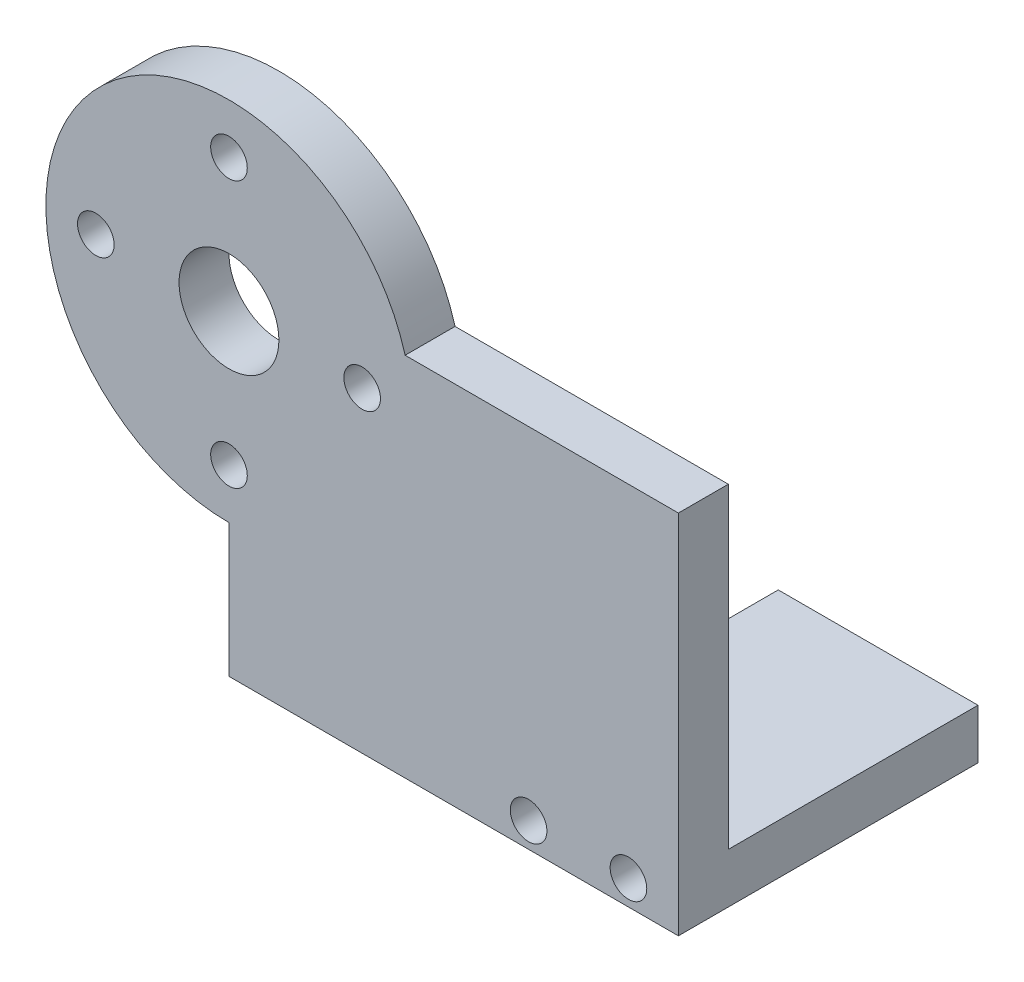
ISO-10303-21;
HEADER;
FILE_DESCRIPTION(('STEP AP214'),'2;1');
FILE_NAME('part.step','',(''),(''),'','','');
FILE_SCHEMA(('AUTOMOTIVE_DESIGN { 1 0 10303 214 1 1 1 1 }'));
ENDSEC;
DATA;
#1=APPLICATION_CONTEXT('core data for automotive mechanical design processes');
#2=APPLICATION_PROTOCOL_DEFINITION('international standard','automotive_design',2000,#1);
#3=PRODUCT_CONTEXT('',#1,'mechanical');
#4=PRODUCT('Part','Part','',(#3));
#5=PRODUCT_RELATED_PRODUCT_CATEGORY('part','',(#4));
#6=PRODUCT_DEFINITION_FORMATION('','',#4);
#7=PRODUCT_DEFINITION_CONTEXT('part definition',#1,'design');
#8=PRODUCT_DEFINITION('design','',#6,#7);
#9=PRODUCT_DEFINITION_SHAPE('','',#8);
#10=(LENGTH_UNIT() NAMED_UNIT(*) SI_UNIT(.MILLI.,.METRE.));
#11=(NAMED_UNIT(*) PLANE_ANGLE_UNIT() SI_UNIT($,.RADIAN.));
#12=(NAMED_UNIT(*) SI_UNIT($,.STERADIAN.) SOLID_ANGLE_UNIT());
#13=UNCERTAINTY_MEASURE_WITH_UNIT(LENGTH_MEASURE(1.E-05),#10,'distance_accuracy_value','');
#14=(GEOMETRIC_REPRESENTATION_CONTEXT(3) GLOBAL_UNCERTAINTY_ASSIGNED_CONTEXT((#13)) GLOBAL_UNIT_ASSIGNED_CONTEXT((#10,
#11,#12)) REPRESENTATION_CONTEXT('',''));
#15=CARTESIAN_POINT('',(0.,0.,0.));
#16=DIRECTION('',(0.,0.,1.));
#17=DIRECTION('',(1.,0.,0.));
#18=AXIS2_PLACEMENT_3D('',#15,#16,#17);
#19=CARTESIAN_POINT('',(0.,0.,15.));
#20=DIRECTION('',(0.,0.,1.));
#21=DIRECTION('',(1.,0.,0.));
#22=AXIS2_PLACEMENT_3D('',#19,#20,#21);
#23=PLANE('',#22);
#24=CARTESIAN_POINT('',(0.,-8.,15.));
#25=DIRECTION('',(0.,0.,1.));
#26=DIRECTION('',(1.,0.,0.));
#27=AXIS2_PLACEMENT_3D('',#24,#25,#26);
#28=CIRCLE('',#27,1.1);
#29=CARTESIAN_POINT('',(1.1,-8.,15.));
#30=VERTEX_POINT('',#29);
#31=EDGE_CURVE('E247',#30,#30,#28,.F.);
#32=ORIENTED_EDGE('',*,*,#31,.F.);
#33=EDGE_LOOP('',(#32));
#34=FACE_BOUND('',#33,.T.);
#35=CARTESIAN_POINT('',(0.,8.,15.));
#36=DIRECTION('',(0.,0.,1.));
#37=DIRECTION('',(1.,0.,0.));
#38=AXIS2_PLACEMENT_3D('',#35,#36,#37);
#39=CIRCLE('',#38,1.1);
#40=CARTESIAN_POINT('',(1.1,8.,15.));
#41=VERTEX_POINT('',#40);
#42=EDGE_CURVE('E249',#41,#41,#39,.F.);
#43=ORIENTED_EDGE('',*,*,#42,.F.);
#44=EDGE_LOOP('',(#43));
#45=FACE_BOUND('',#44,.T.);
#46=CARTESIAN_POINT('',(-8.,0.,15.));
#47=DIRECTION('',(0.,0.,1.));
#48=DIRECTION('',(1.,0.,0.));
#49=AXIS2_PLACEMENT_3D('',#46,#47,#48);
#50=CIRCLE('',#49,1.1);
#51=CARTESIAN_POINT('',(-6.9,0.,15.));
#52=VERTEX_POINT('',#51);
#53=EDGE_CURVE('E241',#52,#52,#50,.F.);
#54=ORIENTED_EDGE('',*,*,#53,.F.);
#55=EDGE_LOOP('',(#54));
#56=FACE_BOUND('',#55,.T.);
#57=CARTESIAN_POINT('',(8.,0.,15.));
#58=DIRECTION('',(0.,0.,1.));
#59=DIRECTION('',(1.,0.,0.));
#60=AXIS2_PLACEMENT_3D('',#57,#58,#59);
#61=CIRCLE('',#60,1.1);
#62=CARTESIAN_POINT('',(9.1,0.,15.));
#63=VERTEX_POINT('',#62);
#64=EDGE_CURVE('E226',#63,#63,#61,.F.);
#65=ORIENTED_EDGE('',*,*,#64,.F.);
#66=EDGE_LOOP('',(#65));
#67=FACE_BOUND('',#66,.T.);
#68=CARTESIAN_POINT('',(0.,0.,15.));
#69=DIRECTION('',(0.,0.,1.));
#70=DIRECTION('',(1.,0.,0.));
#71=AXIS2_PLACEMENT_3D('',#68,#69,#70);
#72=CIRCLE('',#71,3.);
#73=CARTESIAN_POINT('',(3.,0.,15.));
#74=VERTEX_POINT('',#73);
#75=EDGE_CURVE('E136',#74,#74,#72,.F.);
#76=ORIENTED_EDGE('',*,*,#75,.F.);
#77=EDGE_LOOP('',(#76));
#78=FACE_BOUND('',#77,.T.);
#79=DIRECTION('',(0.,1.,0.));
#80=VECTOR('',#79,1.);
#81=CARTESIAN_POINT('',(15.,0.,15.));
#82=LINE('',#81,#80);
#83=CARTESIAN_POINT('',(15.,-19.,15.));
#84=VERTEX_POINT('',#83);
#85=CARTESIAN_POINT('',(15.,-16.,15.));
#86=VERTEX_POINT('',#85);
#87=EDGE_CURVE('E11',#84,#86,#82,.T.);
#88=ORIENTED_EDGE('',*,*,#87,.F.);
#89=DIRECTION('',(1.,0.,0.));
#90=VECTOR('',#89,1.);
#91=CARTESIAN_POINT('',(0.,-19.,15.));
#92=LINE('',#91,#90);
#93=CARTESIAN_POINT('',(0.,-19.,15.));
#94=VERTEX_POINT('',#93);
#95=EDGE_CURVE('E119',#94,#84,#92,.T.);
#96=ORIENTED_EDGE('',*,*,#95,.F.);
#97=DIRECTION('',(0.,-1.,0.));
#98=VECTOR('',#97,1.);
#99=CARTESIAN_POINT('',(0.,-19.,15.));
#100=LINE('',#99,#98);
#101=CARTESIAN_POINT('',(0.,-11.,15.));
#102=VERTEX_POINT('',#101);
#103=EDGE_CURVE('E117',#102,#94,#100,.T.);
#104=ORIENTED_EDGE('',*,*,#103,.F.);
#105=CARTESIAN_POINT('',(0.,0.,15.));
#106=DIRECTION('',(0.,0.,1.));
#107=DIRECTION('',(1.,0.,0.));
#108=AXIS2_PLACEMENT_3D('',#105,#106,#107);
#109=CIRCLE('',#108,11.);
#110=CARTESIAN_POINT('',(10.5830052442584,3.,15.));
#111=VERTEX_POINT('',#110);
#112=EDGE_CURVE('E191',#111,#102,#109,.T.);
#113=ORIENTED_EDGE('',*,*,#112,.F.);
#114=DIRECTION('',(-1.,0.,0.));
#115=VECTOR('',#114,1.);
#116=CARTESIAN_POINT('',(0.,3.,15.));
#117=LINE('',#116,#115);
#118=CARTESIAN_POINT('',(27.,3.,15.));
#119=VERTEX_POINT('',#118);
#120=EDGE_CURVE('E158',#119,#111,#117,.T.);
#121=ORIENTED_EDGE('',*,*,#120,.F.);
#122=DIRECTION('',(0.,1.,0.));
#123=VECTOR('',#122,1.);
#124=CARTESIAN_POINT('',(27.,-19.,15.));
#125=LINE('',#124,#123);
#126=CARTESIAN_POINT('',(27.,-16.,15.));
#127=VERTEX_POINT('',#126);
#128=EDGE_CURVE('E175',#127,#119,#125,.T.);
#129=ORIENTED_EDGE('',*,*,#128,.F.);
#130=DIRECTION('',(1.,0.,0.));
#131=VECTOR('',#130,1.);
#132=CARTESIAN_POINT('',(0.,-16.,15.));
#133=LINE('',#132,#131);
#134=EDGE_CURVE('E54',#86,#127,#133,.T.);
#135=ORIENTED_EDGE('',*,*,#134,.F.);
#136=EDGE_LOOP('',(#88,#96,#104,#113,#121,#129,#135));
#137=FACE_BOUND('',#136,.T.);
#138=ADVANCED_FACE('F44',(#34,#45,#56,#67,#78,#137),#23,.F.);
#139=CARTESIAN_POINT('',(0.,0.,18.));
#140=DIRECTION('',(0.,0.,-1.));
#141=DIRECTION('',(-1.,0.,0.));
#142=AXIS2_PLACEMENT_3D('',#139,#140,#141);
#143=CYLINDRICAL_SURFACE('',#142,11.);
#144=DIRECTION('',(0.,0.,-1.));
#145=VECTOR('',#144,1.);
#146=CARTESIAN_POINT('',(0.,-11.,18.));
#147=LINE('',#146,#145);
#148=CARTESIAN_POINT('',(0.,-11.,18.));
#149=VERTEX_POINT('',#148);
#150=EDGE_CURVE('E197',#149,#102,#147,.T.);
#151=ORIENTED_EDGE('',*,*,#150,.F.);
#152=CARTESIAN_POINT('',(0.,0.,18.));
#153=DIRECTION('',(0.,0.,1.));
#154=DIRECTION('',(1.,0.,0.));
#155=AXIS2_PLACEMENT_3D('',#152,#153,#154);
#156=CIRCLE('',#155,11.);
#157=CARTESIAN_POINT('',(10.5830052442584,3.,18.));
#158=VERTEX_POINT('',#157);
#159=EDGE_CURVE('E195',#158,#149,#156,.T.);
#160=ORIENTED_EDGE('',*,*,#159,.F.);
#161=DIRECTION('',(0.,0.,-1.));
#162=VECTOR('',#161,1.);
#163=CARTESIAN_POINT('',(10.5830052442584,3.,18.));
#164=LINE('',#163,#162);
#165=EDGE_CURVE('E190',#111,#158,#164,.F.);
#166=ORIENTED_EDGE('',*,*,#165,.F.);
#167=ORIENTED_EDGE('',*,*,#112,.T.);
#168=EDGE_LOOP('',(#151,#160,#166,#167));
#169=FACE_BOUND('',#168,.T.);
#170=ADVANCED_FACE('F50',(#169),#143,.T.);
#171=CARTESIAN_POINT('',(0.,0.,18.));
#172=DIRECTION('',(0.,0.,1.));
#173=DIRECTION('',(1.,0.,0.));
#174=AXIS2_PLACEMENT_3D('',#171,#172,#173);
#175=PLANE('',#174);
#176=CARTESIAN_POINT('',(18.,-17.5,18.));
#177=DIRECTION('',(0.,0.,1.));
#178=DIRECTION('',(1.,0.,0.));
#179=AXIS2_PLACEMENT_3D('',#176,#177,#178);
#180=CIRCLE('',#179,1.1);
#181=CARTESIAN_POINT('',(19.1,-17.5,18.));
#182=VERTEX_POINT('',#181);
#183=EDGE_CURVE('E210',#182,#182,#180,.T.);
#184=ORIENTED_EDGE('',*,*,#183,.F.);
#185=EDGE_LOOP('',(#184));
#186=FACE_BOUND('',#185,.T.);
#187=CARTESIAN_POINT('',(24.,-17.5,18.));
#188=DIRECTION('',(0.,0.,1.));
#189=DIRECTION('',(1.,0.,0.));
#190=AXIS2_PLACEMENT_3D('',#187,#188,#189);
#191=CIRCLE('',#190,1.1);
#192=CARTESIAN_POINT('',(25.1,-17.5,18.));
#193=VERTEX_POINT('',#192);
#194=EDGE_CURVE('E214',#193,#193,#191,.T.);
#195=ORIENTED_EDGE('',*,*,#194,.F.);
#196=EDGE_LOOP('',(#195));
#197=FACE_BOUND('',#196,.T.);
#198=CARTESIAN_POINT('',(0.,-8.,18.));
#199=DIRECTION('',(0.,0.,1.));
#200=DIRECTION('',(1.,0.,0.));
#201=AXIS2_PLACEMENT_3D('',#198,#199,#200);
#202=CIRCLE('',#201,1.1);
#203=CARTESIAN_POINT('',(1.1,-8.,18.));
#204=VERTEX_POINT('',#203);
#205=EDGE_CURVE('E224',#204,#204,#202,.T.);
#206=ORIENTED_EDGE('',*,*,#205,.F.);
#207=EDGE_LOOP('',(#206));
#208=FACE_BOUND('',#207,.T.);
#209=CARTESIAN_POINT('',(0.,8.,18.));
#210=DIRECTION('',(0.,0.,1.));
#211=DIRECTION('',(1.,0.,0.));
#212=AXIS2_PLACEMENT_3D('',#209,#210,#211);
#213=CIRCLE('',#212,1.1);
#214=CARTESIAN_POINT('',(1.1,8.,18.));
#215=VERTEX_POINT('',#214);
#216=EDGE_CURVE('E230',#215,#215,#213,.T.);
#217=ORIENTED_EDGE('',*,*,#216,.F.);
#218=EDGE_LOOP('',(#217));
#219=FACE_BOUND('',#218,.T.);
#220=CARTESIAN_POINT('',(-8.,0.,18.));
#221=DIRECTION('',(0.,0.,1.));
#222=DIRECTION('',(1.,0.,0.));
#223=AXIS2_PLACEMENT_3D('',#220,#221,#222);
#224=CIRCLE('',#223,1.1);
#225=CARTESIAN_POINT('',(-6.9,0.,18.));
#226=VERTEX_POINT('',#225);
#227=EDGE_CURVE('E231',#226,#226,#224,.T.);
#228=ORIENTED_EDGE('',*,*,#227,.F.);
#229=EDGE_LOOP('',(#228));
#230=FACE_BOUND('',#229,.T.);
#231=CARTESIAN_POINT('',(8.,0.,18.));
#232=DIRECTION('',(0.,0.,1.));
#233=DIRECTION('',(1.,0.,0.));
#234=AXIS2_PLACEMENT_3D('',#231,#232,#233);
#235=CIRCLE('',#234,1.1);
#236=CARTESIAN_POINT('',(9.1,0.,18.));
#237=VERTEX_POINT('',#236);
#238=EDGE_CURVE('E213',#237,#237,#235,.T.);
#239=ORIENTED_EDGE('',*,*,#238,.F.);
#240=EDGE_LOOP('',(#239));
#241=FACE_BOUND('',#240,.T.);
#242=CARTESIAN_POINT('',(0.,0.,18.));
#243=DIRECTION('',(0.,0.,1.));
#244=DIRECTION('',(1.,0.,0.));
#245=AXIS2_PLACEMENT_3D('',#242,#243,#244);
#246=CIRCLE('',#245,3.);
#247=CARTESIAN_POINT('',(3.,0.,18.));
#248=VERTEX_POINT('',#247);
#249=EDGE_CURVE('E143',#248,#248,#246,.T.);
#250=ORIENTED_EDGE('',*,*,#249,.F.);
#251=EDGE_LOOP('',(#250));
#252=FACE_BOUND('',#251,.T.);
#253=DIRECTION('',(1.,0.,0.));
#254=VECTOR('',#253,1.);
#255=CARTESIAN_POINT('',(0.,-19.,18.));
#256=LINE('',#255,#254);
#257=CARTESIAN_POINT('',(0.,-19.,18.));
#258=VERTEX_POINT('',#257);
#259=CARTESIAN_POINT('',(27.,-19.,18.));
#260=VERTEX_POINT('',#259);
#261=EDGE_CURVE('E160',#258,#260,#256,.T.);
#262=ORIENTED_EDGE('',*,*,#261,.T.);
#263=DIRECTION('',(0.,1.,0.));
#264=VECTOR('',#263,1.);
#265=CARTESIAN_POINT('',(27.,-19.,18.));
#266=LINE('',#265,#264);
#267=CARTESIAN_POINT('',(27.,3.,18.));
#268=VERTEX_POINT('',#267);
#269=EDGE_CURVE('E161',#260,#268,#266,.T.);
#270=ORIENTED_EDGE('',*,*,#269,.T.);
#271=DIRECTION('',(-1.,0.,0.));
#272=VECTOR('',#271,1.);
#273=CARTESIAN_POINT('',(0.,3.,18.));
#274=LINE('',#273,#272);
#275=EDGE_CURVE('E163',#268,#158,#274,.T.);
#276=ORIENTED_EDGE('',*,*,#275,.T.);
#277=ORIENTED_EDGE('',*,*,#159,.T.);
#278=DIRECTION('',(0.,-1.,0.));
#279=VECTOR('',#278,1.);
#280=CARTESIAN_POINT('',(0.,-19.,18.));
#281=LINE('',#280,#279);
#282=EDGE_CURVE('E152',#149,#258,#281,.T.);
#283=ORIENTED_EDGE('',*,*,#282,.T.);
#284=EDGE_LOOP('',(#262,#270,#276,#277,#283));
#285=FACE_BOUND('',#284,.T.);
#286=ADVANCED_FACE('F257',(#186,#197,#208,#219,#230,#241,#252,#285),#175,.T.);
#287=CARTESIAN_POINT('',(0.,-19.,18.));
#288=DIRECTION('',(1.,0.,0.));
#289=DIRECTION('',(0.,0.,-1.));
#290=AXIS2_PLACEMENT_3D('',#287,#288,#289);
#291=PLANE('',#290);
#292=ORIENTED_EDGE('',*,*,#282,.F.);
#293=ORIENTED_EDGE('',*,*,#150,.T.);
#294=ORIENTED_EDGE('',*,*,#103,.T.);
#295=DIRECTION('',(0.,0.,-1.));
#296=VECTOR('',#295,1.);
#297=CARTESIAN_POINT('',(0.,-19.,18.));
#298=LINE('',#297,#296);
#299=EDGE_CURVE('E183',#258,#94,#298,.T.);
#300=ORIENTED_EDGE('',*,*,#299,.F.);
#301=EDGE_LOOP('',(#292,#293,#294,#300));
#302=FACE_BOUND('',#301,.T.);
#303=ADVANCED_FACE('F263',(#302),#291,.F.);
#304=CARTESIAN_POINT('',(0.,3.,18.));
#305=DIRECTION('',(0.,-1.,0.));
#306=DIRECTION('',(0.,0.,-1.));
#307=AXIS2_PLACEMENT_3D('',#304,#305,#306);
#308=PLANE('',#307);
#309=ORIENTED_EDGE('',*,*,#120,.T.);
#310=ORIENTED_EDGE('',*,*,#165,.T.);
#311=ORIENTED_EDGE('',*,*,#275,.F.);
#312=DIRECTION('',(0.,0.,-1.));
#313=VECTOR('',#312,1.);
#314=CARTESIAN_POINT('',(27.,3.,18.));
#315=LINE('',#314,#313);
#316=EDGE_CURVE('E169',#268,#119,#315,.T.);
#317=ORIENTED_EDGE('',*,*,#316,.T.);
#318=EDGE_LOOP('',(#309,#310,#311,#317));
#319=FACE_BOUND('',#318,.T.);
#320=ADVANCED_FACE('F280',(#319),#308,.F.);
#321=CARTESIAN_POINT('',(0.,-19.,18.));
#322=DIRECTION('',(0.,1.,0.));
#323=DIRECTION('',(0.,0.,1.));
#324=AXIS2_PLACEMENT_3D('',#321,#322,#323);
#325=PLANE('',#324);
#326=DIRECTION('',(0.,0.,-1.));
#327=VECTOR('',#326,1.);
#328=CARTESIAN_POINT('',(27.,-19.,18.));
#329=LINE('',#328,#327);
#330=CARTESIAN_POINT('',(27.,-19.,0.));
#331=VERTEX_POINT('',#330);
#332=EDGE_CURVE('E185',#260,#331,#329,.T.);
#333=ORIENTED_EDGE('',*,*,#332,.F.);
#334=ORIENTED_EDGE('',*,*,#261,.F.);
#335=ORIENTED_EDGE('',*,*,#299,.T.);
#336=ORIENTED_EDGE('',*,*,#95,.T.);
#337=DIRECTION('',(0.,0.,-1.));
#338=VECTOR('',#337,1.);
#339=CARTESIAN_POINT('',(15.,-19.,18.));
#340=LINE('',#339,#338);
#341=CARTESIAN_POINT('',(15.,-19.,0.));
#342=VERTEX_POINT('',#341);
#343=EDGE_CURVE('E108',#84,#342,#340,.T.);
#344=ORIENTED_EDGE('',*,*,#343,.T.);
#345=DIRECTION('',(1.,0.,0.));
#346=VECTOR('',#345,1.);
#347=CARTESIAN_POINT('',(15.,-19.,0.));
#348=LINE('',#347,#346);
#349=EDGE_CURVE('E114',#342,#331,#348,.T.);
#350=ORIENTED_EDGE('',*,*,#349,.T.);
#351=EDGE_LOOP('',(#333,#334,#335,#336,#344,#350));
#352=FACE_BOUND('',#351,.T.);
#353=ADVANCED_FACE('F115',(#352),#325,.F.);
#354=CARTESIAN_POINT('',(27.,-19.,18.));
#355=DIRECTION('',(-1.,0.,0.));
#356=DIRECTION('',(0.,0.,1.));
#357=AXIS2_PLACEMENT_3D('',#354,#355,#356);
#358=PLANE('',#357);
#359=ORIENTED_EDGE('',*,*,#316,.F.);
#360=ORIENTED_EDGE('',*,*,#269,.F.);
#361=ORIENTED_EDGE('',*,*,#332,.T.);
#362=DIRECTION('',(0.,1.,0.));
#363=VECTOR('',#362,1.);
#364=CARTESIAN_POINT('',(27.,-19.,0.));
#365=LINE('',#364,#363);
#366=CARTESIAN_POINT('',(27.,-16.,0.));
#367=VERTEX_POINT('',#366);
#368=EDGE_CURVE('E129',#331,#367,#365,.T.);
#369=ORIENTED_EDGE('',*,*,#368,.T.);
#370=DIRECTION('',(0.,0.,-1.));
#371=VECTOR('',#370,1.);
#372=CARTESIAN_POINT('',(27.,-16.,18.));
#373=LINE('',#372,#371);
#374=EDGE_CURVE('E124',#127,#367,#373,.T.);
#375=ORIENTED_EDGE('',*,*,#374,.F.);
#376=ORIENTED_EDGE('',*,*,#128,.T.);
#377=EDGE_LOOP('',(#359,#360,#361,#369,#375,#376));
#378=FACE_BOUND('',#377,.T.);
#379=ADVANCED_FACE('F275',(#378),#358,.F.);
#380=CARTESIAN_POINT('',(15.,-19.,18.));
#381=DIRECTION('',(1.,0.,0.));
#382=DIRECTION('',(0.,0.,-1.));
#383=AXIS2_PLACEMENT_3D('',#380,#381,#382);
#384=PLANE('',#383);
#385=ORIENTED_EDGE('',*,*,#343,.F.);
#386=ORIENTED_EDGE('',*,*,#87,.T.);
#387=DIRECTION('',(0.,0.,-1.));
#388=VECTOR('',#387,1.);
#389=CARTESIAN_POINT('',(15.,-16.,18.));
#390=LINE('',#389,#388);
#391=CARTESIAN_POINT('',(15.,-16.,0.));
#392=VERTEX_POINT('',#391);
#393=EDGE_CURVE('E133',#86,#392,#390,.T.);
#394=ORIENTED_EDGE('',*,*,#393,.T.);
#395=DIRECTION('',(0.,-1.,0.));
#396=VECTOR('',#395,1.);
#397=CARTESIAN_POINT('',(15.,-19.,0.));
#398=LINE('',#397,#396);
#399=EDGE_CURVE('E130',#392,#342,#398,.T.);
#400=ORIENTED_EDGE('',*,*,#399,.T.);
#401=EDGE_LOOP('',(#385,#386,#394,#400));
#402=FACE_BOUND('',#401,.T.);
#403=ADVANCED_FACE('F131',(#402),#384,.F.);
#404=CARTESIAN_POINT('',(15.,-16.,18.));
#405=DIRECTION('',(0.,-1.,0.));
#406=DIRECTION('',(0.,0.,-1.));
#407=AXIS2_PLACEMENT_3D('',#404,#405,#406);
#408=PLANE('',#407);
#409=ORIENTED_EDGE('',*,*,#393,.F.);
#410=ORIENTED_EDGE('',*,*,#134,.T.);
#411=ORIENTED_EDGE('',*,*,#374,.T.);
#412=DIRECTION('',(-1.,0.,0.));
#413=VECTOR('',#412,1.);
#414=CARTESIAN_POINT('',(15.,-16.,0.));
#415=LINE('',#414,#413);
#416=EDGE_CURVE('E150',#367,#392,#415,.T.);
#417=ORIENTED_EDGE('',*,*,#416,.T.);
#418=EDGE_LOOP('',(#409,#410,#411,#417));
#419=FACE_BOUND('',#418,.T.);
#420=ADVANCED_FACE('F301',(#419),#408,.F.);
#421=CARTESIAN_POINT('',(0.,0.,0.));
#422=DIRECTION('',(0.,0.,-1.));
#423=DIRECTION('',(-1.,0.,0.));
#424=AXIS2_PLACEMENT_3D('',#421,#422,#423);
#425=PLANE('',#424);
#426=CARTESIAN_POINT('',(18.,-17.5,0.));
#427=DIRECTION('',(0.,0.,-1.));
#428=DIRECTION('',(-1.,0.,0.));
#429=AXIS2_PLACEMENT_3D('',#426,#427,#428);
#430=CIRCLE('',#429,1.1);
#431=CARTESIAN_POINT('',(16.9,-17.5,0.));
#432=VERTEX_POINT('',#431);
#433=EDGE_CURVE('E47',#432,#432,#430,.F.);
#434=ORIENTED_EDGE('',*,*,#433,.T.);
#435=EDGE_LOOP('',(#434));
#436=FACE_BOUND('',#435,.T.);
#437=CARTESIAN_POINT('',(24.,-17.5,0.));
#438=DIRECTION('',(0.,0.,-1.));
#439=DIRECTION('',(-1.,0.,0.));
#440=AXIS2_PLACEMENT_3D('',#437,#438,#439);
#441=CIRCLE('',#440,1.1);
#442=CARTESIAN_POINT('',(22.9,-17.5,0.));
#443=VERTEX_POINT('',#442);
#444=EDGE_CURVE('E204',#443,#443,#441,.F.);
#445=ORIENTED_EDGE('',*,*,#444,.T.);
#446=EDGE_LOOP('',(#445));
#447=FACE_BOUND('',#446,.T.);
#448=ORIENTED_EDGE('',*,*,#399,.F.);
#449=ORIENTED_EDGE('',*,*,#416,.F.);
#450=ORIENTED_EDGE('',*,*,#368,.F.);
#451=ORIENTED_EDGE('',*,*,#349,.F.);
#452=EDGE_LOOP('',(#448,#449,#450,#451));
#453=FACE_BOUND('',#452,.T.);
#454=ADVANCED_FACE('F122',(#436,#447,#453),#425,.T.);
#455=CARTESIAN_POINT('',(0.,0.,18.));
#456=DIRECTION('',(0.,0.,-1.));
#457=DIRECTION('',(-1.,0.,0.));
#458=AXIS2_PLACEMENT_3D('',#455,#456,#457);
#459=CYLINDRICAL_SURFACE('',#458,3.);
#460=ORIENTED_EDGE('',*,*,#249,.T.);
#461=EDGE_LOOP('',(#460));
#462=FACE_BOUND('',#461,.T.);
#463=ORIENTED_EDGE('',*,*,#75,.T.);
#464=EDGE_LOOP('',(#463));
#465=FACE_BOUND('',#464,.T.);
#466=ADVANCED_FACE('F260',(#462,#465),#459,.F.);
#467=CARTESIAN_POINT('',(8.,0.,18.));
#468=DIRECTION('',(0.,0.,-1.));
#469=DIRECTION('',(-1.,0.,0.));
#470=AXIS2_PLACEMENT_3D('',#467,#468,#469);
#471=CYLINDRICAL_SURFACE('',#470,1.1);
#472=ORIENTED_EDGE('',*,*,#238,.T.);
#473=EDGE_LOOP('',(#472));
#474=FACE_BOUND('',#473,.T.);
#475=ORIENTED_EDGE('',*,*,#64,.T.);
#476=EDGE_LOOP('',(#475));
#477=FACE_BOUND('',#476,.T.);
#478=ADVANCED_FACE('F309',(#474,#477),#471,.F.);
#479=CARTESIAN_POINT('',(-8.,0.,18.));
#480=DIRECTION('',(0.,0.,-1.));
#481=DIRECTION('',(-1.,0.,0.));
#482=AXIS2_PLACEMENT_3D('',#479,#480,#481);
#483=CYLINDRICAL_SURFACE('',#482,1.1);
#484=ORIENTED_EDGE('',*,*,#227,.T.);
#485=EDGE_LOOP('',(#484));
#486=FACE_BOUND('',#485,.T.);
#487=ORIENTED_EDGE('',*,*,#53,.T.);
#488=EDGE_LOOP('',(#487));
#489=FACE_BOUND('',#488,.T.);
#490=ADVANCED_FACE('F315',(#486,#489),#483,.F.);
#491=CARTESIAN_POINT('',(0.,8.,18.));
#492=DIRECTION('',(0.,0.,-1.));
#493=DIRECTION('',(-1.,0.,0.));
#494=AXIS2_PLACEMENT_3D('',#491,#492,#493);
#495=CYLINDRICAL_SURFACE('',#494,1.1);
#496=ORIENTED_EDGE('',*,*,#216,.T.);
#497=EDGE_LOOP('',(#496));
#498=FACE_BOUND('',#497,.T.);
#499=ORIENTED_EDGE('',*,*,#42,.T.);
#500=EDGE_LOOP('',(#499));
#501=FACE_BOUND('',#500,.T.);
#502=ADVANCED_FACE('F316',(#498,#501),#495,.F.);
#503=CARTESIAN_POINT('',(0.,-8.,18.));
#504=DIRECTION('',(0.,0.,-1.));
#505=DIRECTION('',(-1.,0.,0.));
#506=AXIS2_PLACEMENT_3D('',#503,#504,#505);
#507=CYLINDRICAL_SURFACE('',#506,1.1);
#508=ORIENTED_EDGE('',*,*,#205,.T.);
#509=EDGE_LOOP('',(#508));
#510=FACE_BOUND('',#509,.T.);
#511=ORIENTED_EDGE('',*,*,#31,.T.);
#512=EDGE_LOOP('',(#511));
#513=FACE_BOUND('',#512,.T.);
#514=ADVANCED_FACE('F319',(#510,#513),#507,.F.);
#515=CARTESIAN_POINT('',(24.,-17.5,18.));
#516=DIRECTION('',(0.,0.,-1.));
#517=DIRECTION('',(-1.,0.,0.));
#518=AXIS2_PLACEMENT_3D('',#515,#516,#517);
#519=CYLINDRICAL_SURFACE('',#518,1.1);
#520=ORIENTED_EDGE('',*,*,#444,.F.);
#521=EDGE_LOOP('',(#520));
#522=FACE_BOUND('',#521,.T.);
#523=ORIENTED_EDGE('',*,*,#194,.T.);
#524=EDGE_LOOP('',(#523));
#525=FACE_BOUND('',#524,.T.);
#526=ADVANCED_FACE('F322',(#522,#525),#519,.F.);
#527=CARTESIAN_POINT('',(18.,-17.5,18.));
#528=DIRECTION('',(0.,0.,-1.));
#529=DIRECTION('',(-1.,0.,0.));
#530=AXIS2_PLACEMENT_3D('',#527,#528,#529);
#531=CYLINDRICAL_SURFACE('',#530,1.1);
#532=ORIENTED_EDGE('',*,*,#433,.F.);
#533=EDGE_LOOP('',(#532));
#534=FACE_BOUND('',#533,.T.);
#535=ORIENTED_EDGE('',*,*,#183,.T.);
#536=EDGE_LOOP('',(#535));
#537=FACE_BOUND('',#536,.T.);
#538=ADVANCED_FACE('F327',(#534,#537),#531,.F.);
#539=CLOSED_SHELL('',(#138,#170,#286,#303,#320,#353,#379,#403,#420,#454,#466,#478,#490,#502,
#514,#526,#538));
#540=MANIFOLD_SOLID_BREP('B2',#539);
#541=ADVANCED_BREP_SHAPE_REPRESENTATION('',(#18,#540),#14);
#542=SHAPE_DEFINITION_REPRESENTATION(#9,#541);
ENDSEC;
END-ISO-10303-21;
